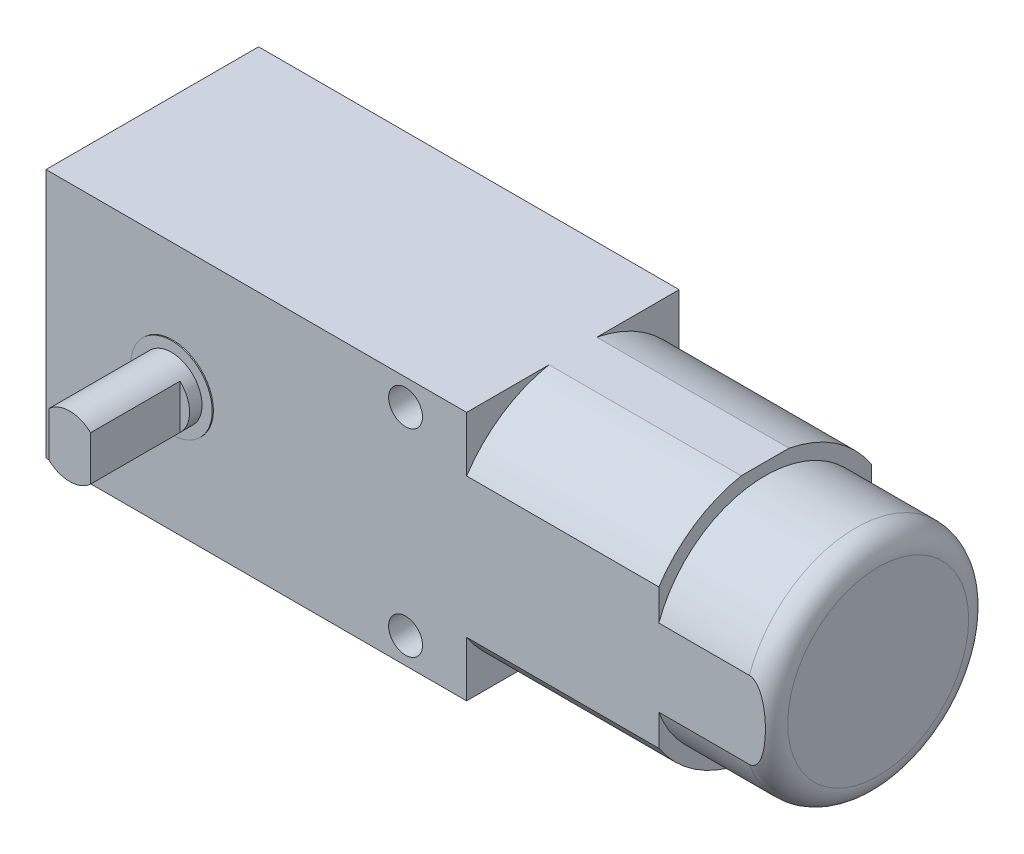
ISO-10303-21;
HEADER;
FILE_DESCRIPTION(('STEP AP214'),'2;1');
FILE_NAME('part.step','',(''),(''),'','','');
FILE_SCHEMA(('AUTOMOTIVE_DESIGN { 1 0 10303 214 1 1 1 1 }'));
ENDSEC;
DATA;
#1=APPLICATION_CONTEXT('core data for automotive mechanical design processes');
#2=APPLICATION_PROTOCOL_DEFINITION('international standard','automotive_design',2000,#1);
#3=PRODUCT_CONTEXT('',#1,'mechanical');
#4=PRODUCT('Part','Part','',(#3));
#5=PRODUCT_RELATED_PRODUCT_CATEGORY('part','',(#4));
#6=PRODUCT_DEFINITION_FORMATION('','',#4);
#7=PRODUCT_DEFINITION_CONTEXT('part definition',#1,'design');
#8=PRODUCT_DEFINITION('design','',#6,#7);
#9=PRODUCT_DEFINITION_SHAPE('','',#8);
#10=(LENGTH_UNIT() NAMED_UNIT(*) SI_UNIT(.MILLI.,.METRE.));
#11=(NAMED_UNIT(*) PLANE_ANGLE_UNIT() SI_UNIT($,.RADIAN.));
#12=(NAMED_UNIT(*) SI_UNIT($,.STERADIAN.) SOLID_ANGLE_UNIT());
#13=UNCERTAINTY_MEASURE_WITH_UNIT(LENGTH_MEASURE(1.E-05),#10,'distance_accuracy_value','');
#14=(GEOMETRIC_REPRESENTATION_CONTEXT(3) GLOBAL_UNCERTAINTY_ASSIGNED_CONTEXT((#13)) GLOBAL_UNIT_ASSIGNED_CONTEXT((#10,
#11,#12)) REPRESENTATION_CONTEXT('',''));
#15=CARTESIAN_POINT('',(0.,0.,0.));
#16=DIRECTION('',(0.,0.,1.));
#17=DIRECTION('',(1.,0.,0.));
#18=AXIS2_PLACEMENT_3D('',#15,#16,#17);
#19=CARTESIAN_POINT('',(64.2,-11.05,-9.4));
#20=DIRECTION('',(0.,0.,1.));
#21=DIRECTION('',(1.,0.,0.));
#22=AXIS2_PLACEMENT_3D('',#19,#20,#21);
#23=PLANE('',#22);
#24=DIRECTION('',(1.,0.,0.));
#25=VECTOR('',#24,1.);
#26=CARTESIAN_POINT('',(54.2,3.4117444218464,-9.4));
#27=LINE('',#26,#25);
#28=CARTESIAN_POINT('',(54.2,3.4117444218464,-9.4));
#29=VERTEX_POINT('',#28);
#30=CARTESIAN_POINT('',(62.2,3.4117444218464,-9.4));
#31=VERTEX_POINT('',#30);
#32=EDGE_CURVE('E186',#29,#31,#27,.T.);
#33=ORIENTED_EDGE('',*,*,#32,.T.);
#34=CARTESIAN_POINT('',(62.2,3.4117444218464,-9.4));
#35=CARTESIAN_POINT('',(62.2424452355427,3.41185713335466,-9.4));
#36=CARTESIAN_POINT('',(62.2847600139285,3.40779082611758,-9.4));
#37=CARTESIAN_POINT('',(62.3676110899501,3.39230440400399,-9.4));
#38=CARTESIAN_POINT('',(62.4081608010595,3.38095712592433,-9.4));
#39=CARTESIAN_POINT('',(62.486705809901,3.35192913929737,-9.4));
#40=CARTESIAN_POINT('',(62.5247095576766,3.33427075464174,-9.4));
#41=CARTESIAN_POINT('',(62.5979473580936,3.2938138454747,-9.4));
#42=CARTESIAN_POINT('',(62.6331739101488,3.27100200372673,-9.4));
#43=CARTESIAN_POINT('',(62.7246162755101,3.20375229428579,-9.4));
#44=CARTESIAN_POINT('',(62.7779854862007,3.15545616211682,-9.4));
#45=CARTESIAN_POINT('',(62.8767960771071,3.0513589229284,-9.4));
#46=CARTESIAN_POINT('',(62.922213907333,2.99553636079868,-9.4));
#47=CARTESIAN_POINT('',(63.0025246853867,2.88418725861646,-9.4));
#48=CARTESIAN_POINT('',(63.0379924003202,2.82906806503439,-9.4));
#49=CARTESIAN_POINT('',(63.1041098382995,2.7159886926686,-9.4));
#50=CARTESIAN_POINT('',(63.1347553193062,2.65802607070646,-9.4));
#51=CARTESIAN_POINT('',(63.2206021902713,2.48102229976637,-9.4));
#52=CARTESIAN_POINT('',(63.2696272007864,2.35899492009959,-9.4));
#53=CARTESIAN_POINT('',(63.3601695871253,2.09694248841986,-9.4));
#54=CARTESIAN_POINT('',(63.40022380031,1.9564361292036,-9.4));
#55=CARTESIAN_POINT('',(63.4688037246126,1.67253040278015,-9.4));
#56=CARTESIAN_POINT('',(63.4973152765614,1.52912770760538,-9.4));
#57=CARTESIAN_POINT('',(63.5451252943434,1.24049999059707,-9.4));
#58=CARTESIAN_POINT('',(63.5644024374481,1.09527153827709,-9.4));
#59=CARTESIAN_POINT('',(63.5951213555044,0.803978799831361,-9.4));
#60=CARTESIAN_POINT('',(63.6065612994958,0.657914326422289,-9.4));
#61=CARTESIAN_POINT('',(63.6252183787894,0.314716466271715,-9.4));
#62=CARTESIAN_POINT('',(63.6295984097009,0.117426164064127,-9.4));
#63=CARTESIAN_POINT('',(63.6263073701391,-0.277195389387359,-9.4));
#64=CARTESIAN_POINT('',(63.6186266212757,-0.47452654633237,-9.4));
#65=CARTESIAN_POINT('',(63.5901754943477,-0.868593691638928,-9.4));
#66=CARTESIAN_POINT('',(63.5693874596252,-1.06532851691648,-9.4));
#67=CARTESIAN_POINT('',(63.5262109114439,-1.35854135933809,-9.4));
#68=CARTESIAN_POINT('',(63.5098313613865,-1.45591356036913,-9.4));
#69=CARTESIAN_POINT('',(63.4724598719395,-1.64976017431326,-9.4));
#70=CARTESIAN_POINT('',(63.4514690554157,-1.7462347998394,-9.4));
#71=CARTESIAN_POINT('',(63.4038261208585,-1.93890284494212,-9.4));
#72=CARTESIAN_POINT('',(63.3771151862187,-2.03508191881406,-9.4));
#73=CARTESIAN_POINT('',(63.3170648451381,-2.22531904258544,-9.4));
#74=CARTESIAN_POINT('',(63.2837298949045,-2.31937847133493,-9.4));
#75=CARTESIAN_POINT('',(63.2091828894291,-2.50352227767631,-9.4));
#76=CARTESIAN_POINT('',(63.1680342342199,-2.59363191733345,-9.4));
#77=CARTESIAN_POINT('',(63.0757080053422,-2.7684680745083,-9.4));
#78=CARTESIAN_POINT('',(63.0245571227123,-2.85320814090503,-9.4));
#79=CARTESIAN_POINT('',(62.9268313875892,-2.98941829265076,-9.4));
#80=CARTESIAN_POINT('',(62.8835310129869,-3.04321321283262,-9.4));
#81=CARTESIAN_POINT('',(62.7895967927138,-3.14408393926965,-9.4));
#82=CARTESIAN_POINT('',(62.7389737070666,-3.19116940632747,-9.4));
#83=CARTESIAN_POINT('',(62.6469696184736,-3.26177129146753,-9.4));
#84=CARTESIAN_POINT('',(62.6077142305004,-3.28803618007025,-9.4));
#85=CARTESIAN_POINT('',(62.5255904523115,-3.33411895936149,-9.4));
#86=CARTESIAN_POINT('',(62.4827291753378,-3.35394918468195,-9.4));
#87=CARTESIAN_POINT('',(62.4009412508458,-3.38304682221297,-9.4));
#88=CARTESIAN_POINT('',(62.3624307235373,-3.39347327028085,-9.4));
#89=CARTESIAN_POINT('',(62.2841722377477,-3.40768128751918,-9.4));
#90=CARTESIAN_POINT('',(62.2444244030235,-3.41146351909236,-9.4));
#91=CARTESIAN_POINT('',(62.164908512337,-3.41199341385013,-9.4));
#92=CARTESIAN_POINT('',(62.1251404685909,-3.40874357795475,-9.4));
#93=CARTESIAN_POINT('',(62.04656344732,-3.39561061109433,-9.4));
#94=CARTESIAN_POINT('',(62.0077583618931,-3.38570404620325,-9.4));
#95=CARTESIAN_POINT('',(61.9700782274125,-3.3726809196957,-9.4));
#96=B_SPLINE_CURVE_WITH_KNOTS('',3,(#34,#35,#36,#37,#38,#39,#40,#41,#42,#43,#44,#45,#46,#47,#48,
#49,#50,#51,#52,#53,#54,#55,#56,#57,#58,#59,#60,#61,#62,#63,#64,#65,#66,#67,#68,#69,#70,#71,#72,
#73,#74,#75,#76,#77,#78,#79,#80,#81,#82,#83,#84,#85,#86,#87,#88,#89,#90,#91,#92,#93,#94,#95),
.UNSPECIFIED.,.F.,.F.,(4,2,2,2,2,2,2,2,2,2,2,2,2,2,2,2,2,2,2,2,2,2,2,2,2,2,2,2,2,2,4),(0.,
0.126934226659636,0.252618027080472,0.377861583759415,0.503432566065117,0.718121186972019,
0.933435283171618,1.12977675330723,1.32628998767683,1.71977991849235,2.15749672188272,
2.59574884918631,3.03500810297968,3.47436994343707,4.06598497178498,4.65807499494745,
5.2509643240876,5.54709889499976,5.84316143547251,6.14242843982891,6.44149479426365,
6.73823090594177,7.03418572228694,7.24086037132175,7.44723435985258,7.58847501975822,
7.72944331310984,7.84861821564906,7.96778123623622,8.08690188405017,8.20644408897797),.UNSPECIFIED.);
#97=CARTESIAN_POINT('',(62.2,-3.4117444218464,-9.4));
#98=VERTEX_POINT('',#97);
#99=EDGE_CURVE('E348',#31,#98,#96,.T.);
#100=ORIENTED_EDGE('',*,*,#99,.T.);
#101=DIRECTION('',(1.,0.,0.));
#102=VECTOR('',#101,1.);
#103=CARTESIAN_POINT('',(54.2,-3.4117444218464,-9.4));
#104=LINE('',#103,#102);
#105=CARTESIAN_POINT('',(54.2,-3.4117444218464,-9.4));
#106=VERTEX_POINT('',#105);
#107=EDGE_CURVE('E205',#106,#98,#104,.T.);
#108=ORIENTED_EDGE('',*,*,#107,.F.);
#109=DIRECTION('',(0.,1.,0.));
#110=VECTOR('',#109,1.);
#111=CARTESIAN_POINT('',(54.2,0.,-9.4));
#112=LINE('',#111,#110);
#113=CARTESIAN_POINT('',(54.2,-6.18081709808663,-9.4));
#114=VERTEX_POINT('',#113);
#115=EDGE_CURVE('E233',#114,#106,#112,.T.);
#116=ORIENTED_EDGE('',*,*,#115,.F.);
#117=DIRECTION('',(1.,0.,0.));
#118=VECTOR('',#117,1.);
#119=CARTESIAN_POINT('',(37.2,-6.18081709808663,-9.4));
#120=LINE('',#119,#118);
#121=CARTESIAN_POINT('',(37.2,-6.18081709808663,-9.4));
#122=VERTEX_POINT('',#121);
#123=EDGE_CURVE('E242',#122,#114,#120,.T.);
#124=ORIENTED_EDGE('',*,*,#123,.F.);
#125=DIRECTION('',(0.,1.,0.));
#126=VECTOR('',#125,1.);
#127=CARTESIAN_POINT('',(37.2,0.,-9.4));
#128=LINE('',#127,#126);
#129=CARTESIAN_POINT('',(37.2,-11.05,-9.4));
#130=VERTEX_POINT('',#129);
#131=EDGE_CURVE('E257',#130,#122,#128,.T.);
#132=ORIENTED_EDGE('',*,*,#131,.F.);
#133=DIRECTION('',(-1.,0.,0.));
#134=VECTOR('',#133,1.);
#135=CARTESIAN_POINT('',(64.2,-11.05,-9.4));
#136=LINE('',#135,#134);
#137=CARTESIAN_POINT('',(0.,-11.05,-9.4));
#138=VERTEX_POINT('',#137);
#139=EDGE_CURVE('E333',#130,#138,#136,.T.);
#140=ORIENTED_EDGE('',*,*,#139,.T.);
#141=DIRECTION('',(0.,1.,0.));
#142=VECTOR('',#141,1.);
#143=CARTESIAN_POINT('',(0.,-11.05,-9.4));
#144=LINE('',#143,#142);
#145=CARTESIAN_POINT('',(0.,11.05,-9.4));
#146=VERTEX_POINT('',#145);
#147=EDGE_CURVE('E321',#138,#146,#144,.T.);
#148=ORIENTED_EDGE('',*,*,#147,.T.);
#149=DIRECTION('',(-1.,0.,0.));
#150=VECTOR('',#149,1.);
#151=CARTESIAN_POINT('',(64.2,11.05,-9.4));
#152=LINE('',#151,#150);
#153=CARTESIAN_POINT('',(37.2,11.05,-9.4));
#154=VERTEX_POINT('',#153);
#155=EDGE_CURVE('E339',#154,#146,#152,.T.);
#156=ORIENTED_EDGE('',*,*,#155,.F.);
#157=DIRECTION('',(0.,1.,0.));
#158=VECTOR('',#157,1.);
#159=CARTESIAN_POINT('',(37.2,0.,-9.4));
#160=LINE('',#159,#158);
#161=CARTESIAN_POINT('',(37.2,6.18081709808663,-9.4));
#162=VERTEX_POINT('',#161);
#163=EDGE_CURVE('E241',#162,#154,#160,.T.);
#164=ORIENTED_EDGE('',*,*,#163,.F.);
#165=DIRECTION('',(1.,0.,0.));
#166=VECTOR('',#165,1.);
#167=CARTESIAN_POINT('',(37.2,6.18081709808663,-9.4));
#168=LINE('',#167,#166);
#169=CARTESIAN_POINT('',(54.2,6.18081709808663,-9.4));
#170=VERTEX_POINT('',#169);
#171=EDGE_CURVE('E209',#162,#170,#168,.T.);
#172=ORIENTED_EDGE('',*,*,#171,.T.);
#173=DIRECTION('',(0.,1.,0.));
#174=VECTOR('',#173,1.);
#175=CARTESIAN_POINT('',(54.2,0.,-9.4));
#176=LINE('',#175,#174);
#177=EDGE_CURVE('E201',#29,#170,#176,.T.);
#178=ORIENTED_EDGE('',*,*,#177,.F.);
#179=EDGE_LOOP('',(#33,#100,#108,#116,#124,#132,#140,#148,#156,#164,#172,#178));
#180=FACE_BOUND('',#179,.T.);
#181=ADVANCED_FACE('F42',(#180),#23,.F.);
#182=CARTESIAN_POINT('',(64.2,11.05,9.4));
#183=DIRECTION('',(0.,-1.,0.));
#184=DIRECTION('',(0.,0.,-1.));
#185=AXIS2_PLACEMENT_3D('',#182,#183,#184);
#186=PLANE('',#185);
#187=DIRECTION('',(0.,0.,1.));
#188=VECTOR('',#187,1.);
#189=CARTESIAN_POINT('',(54.2,11.05,0.));
#190=LINE('',#189,#188);
#191=CARTESIAN_POINT('',(54.2,11.05,-2.1118712081943));
#192=VERTEX_POINT('',#191);
#193=CARTESIAN_POINT('',(54.2,11.05,2.1118712081943));
#194=VERTEX_POINT('',#193);
#195=EDGE_CURVE('E212',#192,#194,#190,.T.);
#196=ORIENTED_EDGE('',*,*,#195,.F.);
#197=DIRECTION('',(1.,0.,0.));
#198=VECTOR('',#197,1.);
#199=CARTESIAN_POINT('',(37.2,11.05,-2.1118712081943));
#200=LINE('',#199,#198);
#201=CARTESIAN_POINT('',(37.2,11.05,-2.1118712081943));
#202=VERTEX_POINT('',#201);
#203=EDGE_CURVE('E247',#202,#192,#200,.T.);
#204=ORIENTED_EDGE('',*,*,#203,.F.);
#205=DIRECTION('',(0.,0.,1.));
#206=VECTOR('',#205,1.);
#207=CARTESIAN_POINT('',(37.2,11.05,0.));
#208=LINE('',#207,#206);
#209=EDGE_CURVE('E244',#154,#202,#208,.T.);
#210=ORIENTED_EDGE('',*,*,#209,.F.);
#211=ORIENTED_EDGE('',*,*,#155,.T.);
#212=DIRECTION('',(0.,0.,1.));
#213=VECTOR('',#212,1.);
#214=CARTESIAN_POINT('',(0.,11.05,9.4));
#215=LINE('',#214,#213);
#216=CARTESIAN_POINT('',(0.,11.05,9.4));
#217=VERTEX_POINT('',#216);
#218=EDGE_CURVE('E324',#146,#217,#215,.T.);
#219=ORIENTED_EDGE('',*,*,#218,.T.);
#220=DIRECTION('',(-1.,0.,0.));
#221=VECTOR('',#220,1.);
#222=CARTESIAN_POINT('',(64.2,11.05,9.4));
#223=LINE('',#222,#221);
#224=CARTESIAN_POINT('',(37.2,11.05,9.4));
#225=VERTEX_POINT('',#224);
#226=EDGE_CURVE('E337',#225,#217,#223,.T.);
#227=ORIENTED_EDGE('',*,*,#226,.F.);
#228=DIRECTION('',(0.,0.,1.));
#229=VECTOR('',#228,1.);
#230=CARTESIAN_POINT('',(37.2,11.05,0.));
#231=LINE('',#230,#229);
#232=CARTESIAN_POINT('',(37.2,11.05,2.1118712081943));
#233=VERTEX_POINT('',#232);
#234=EDGE_CURVE('E277',#233,#225,#231,.T.);
#235=ORIENTED_EDGE('',*,*,#234,.F.);
#236=DIRECTION('',(1.,0.,0.));
#237=VECTOR('',#236,1.);
#238=CARTESIAN_POINT('',(37.2,11.05,2.1118712081943));
#239=LINE('',#238,#237);
#240=EDGE_CURVE('E282',#233,#194,#239,.T.);
#241=ORIENTED_EDGE('',*,*,#240,.T.);
#242=EDGE_LOOP('',(#196,#204,#210,#211,#219,#227,#235,#241));
#243=FACE_BOUND('',#242,.T.);
#244=ADVANCED_FACE('F356',(#243),#186,.F.);
#245=CARTESIAN_POINT('',(64.2,-11.05,9.4));
#246=DIRECTION('',(0.,0.,-1.));
#247=DIRECTION('',(-1.,0.,0.));
#248=AXIS2_PLACEMENT_3D('',#245,#246,#247);
#249=PLANE('',#248);
#250=CARTESIAN_POINT('',(31.7999999999999,8.75,9.4));
#251=DIRECTION('',(0.,0.,1.));
#252=DIRECTION('',(1.,0.,0.));
#253=AXIS2_PLACEMENT_3D('',#250,#251,#252);
#254=CIRCLE('',#253,1.5);
#255=CARTESIAN_POINT('',(33.2999999999999,8.75,9.4));
#256=VERTEX_POINT('',#255);
#257=EDGE_CURVE('E470',#256,#256,#254,.T.);
#258=ORIENTED_EDGE('',*,*,#257,.F.);
#259=EDGE_LOOP('',(#258));
#260=FACE_BOUND('',#259,.T.);
#261=CARTESIAN_POINT('',(31.7999999999999,-8.75,9.4));
#262=DIRECTION('',(0.,0.,1.));
#263=DIRECTION('',(-1.,0.,0.));
#264=AXIS2_PLACEMENT_3D('',#261,#262,#263);
#265=CIRCLE('',#264,1.5);
#266=CARTESIAN_POINT('',(30.2999999999999,-8.75,9.4));
#267=VERTEX_POINT('',#266);
#268=EDGE_CURVE('E477',#267,#267,#265,.T.);
#269=ORIENTED_EDGE('',*,*,#268,.F.);
#270=EDGE_LOOP('',(#269));
#271=FACE_BOUND('',#270,.T.);
#272=CARTESIAN_POINT('',(11.2,0.,9.4));
#273=DIRECTION('',(0.,0.,-1.));
#274=DIRECTION('',(-1.,0.,0.));
#275=AXIS2_PLACEMENT_3D('',#272,#273,#274);
#276=CIRCLE('',#275,3.6);
#277=CARTESIAN_POINT('',(7.6,0.,9.4));
#278=VERTEX_POINT('',#277);
#279=EDGE_CURVE('E341',#278,#278,#276,.F.);
#280=ORIENTED_EDGE('',*,*,#279,.F.);
#281=EDGE_LOOP('',(#280));
#282=FACE_BOUND('',#281,.T.);
#283=DIRECTION('',(1.,0.,0.));
#284=VECTOR('',#283,1.);
#285=CARTESIAN_POINT('',(54.2,-3.41174442184639,9.4));
#286=LINE('',#285,#284);
#287=CARTESIAN_POINT('',(54.2,-3.41174442184639,9.4));
#288=VERTEX_POINT('',#287);
#289=CARTESIAN_POINT('',(62.2,-3.41174442184639,9.4));
#290=VERTEX_POINT('',#289);
#291=EDGE_CURVE('E236',#288,#290,#286,.T.);
#292=ORIENTED_EDGE('',*,*,#291,.T.);
#293=CARTESIAN_POINT('',(62.2,-3.41174442184639,9.4));
#294=CARTESIAN_POINT('',(62.2424452355427,-3.41185713335465,9.4));
#295=CARTESIAN_POINT('',(62.2847600139285,-3.40779082611757,9.4));
#296=CARTESIAN_POINT('',(62.3676110899501,-3.39230440400398,9.4));
#297=CARTESIAN_POINT('',(62.4081608010595,-3.38095712592432,9.4));
#298=CARTESIAN_POINT('',(62.486705809901,-3.35192913929736,9.4));
#299=CARTESIAN_POINT('',(62.5247095576766,-3.33427075464173,9.4));
#300=CARTESIAN_POINT('',(62.5979473580936,-3.29381384547468,9.4));
#301=CARTESIAN_POINT('',(62.6331739101488,-3.27100200372672,9.4));
#302=CARTESIAN_POINT('',(62.7246162755101,-3.20375229428578,9.4));
#303=CARTESIAN_POINT('',(62.7779854862007,-3.1554561621168,9.4));
#304=CARTESIAN_POINT('',(62.8767960771071,-3.05135892292839,9.4));
#305=CARTESIAN_POINT('',(62.922213907333,-2.99553636079866,9.4));
#306=CARTESIAN_POINT('',(63.0025246853867,-2.88418725861645,9.4));
#307=CARTESIAN_POINT('',(63.0379924003203,-2.82906806503438,9.4));
#308=CARTESIAN_POINT('',(63.1041098382995,-2.71598869266859,9.4));
#309=CARTESIAN_POINT('',(63.1347553193062,-2.65802607070644,9.4));
#310=CARTESIAN_POINT('',(63.2206021902713,-2.48102229976635,9.4));
#311=CARTESIAN_POINT('',(63.2696272007864,-2.35899492009958,9.4));
#312=CARTESIAN_POINT('',(63.3601695871253,-2.09694248841984,9.4));
#313=CARTESIAN_POINT('',(63.40022380031,-1.95643612920359,9.4));
#314=CARTESIAN_POINT('',(63.4688037246126,-1.67253040278013,9.4));
#315=CARTESIAN_POINT('',(63.4973152765614,-1.52912770760535,9.4));
#316=CARTESIAN_POINT('',(63.5451252943434,-1.24049999059705,9.4));
#317=CARTESIAN_POINT('',(63.5644024374481,-1.09527153827706,9.4));
#318=CARTESIAN_POINT('',(63.5951213555044,-0.803978799831333,9.4));
#319=CARTESIAN_POINT('',(63.6065612994958,-0.65791432642226,9.4));
#320=CARTESIAN_POINT('',(63.6252183787894,-0.314716466271684,9.4));
#321=CARTESIAN_POINT('',(63.6295984097009,-0.117426164064095,9.4));
#322=CARTESIAN_POINT('',(63.6263073701391,0.277195389387395,9.4));
#323=CARTESIAN_POINT('',(63.6186266212757,0.474526546332407,9.4));
#324=CARTESIAN_POINT('',(63.5901754943477,0.868593691638967,9.4));
#325=CARTESIAN_POINT('',(63.5693874596251,1.06532851691652,9.4));
#326=CARTESIAN_POINT('',(63.5262109114439,1.35854135933814,9.4));
#327=CARTESIAN_POINT('',(63.5098313613865,1.45591356036918,9.4));
#328=CARTESIAN_POINT('',(63.4724598719395,1.64976017431331,9.4));
#329=CARTESIAN_POINT('',(63.4514690554157,1.74623479983944,9.4));
#330=CARTESIAN_POINT('',(63.4038261208585,1.93890284494217,9.4));
#331=CARTESIAN_POINT('',(63.3771151862187,2.0350819188141,9.4));
#332=CARTESIAN_POINT('',(63.3170648451381,2.22531904258548,9.4));
#333=CARTESIAN_POINT('',(63.2837298949044,2.31937847133497,9.4));
#334=CARTESIAN_POINT('',(63.2091828894291,2.50352227767636,9.4));
#335=CARTESIAN_POINT('',(63.1680342342199,2.5936319173335,9.4));
#336=CARTESIAN_POINT('',(63.0757080053422,2.76846807450835,9.4));
#337=CARTESIAN_POINT('',(63.0245571227123,2.85320814090508,9.4));
#338=CARTESIAN_POINT('',(62.9268313875892,2.9894182926508,9.4));
#339=CARTESIAN_POINT('',(62.8835310129868,3.04321321283265,9.4));
#340=CARTESIAN_POINT('',(62.7895967927137,3.14408393926967,9.4));
#341=CARTESIAN_POINT('',(62.7389737070666,3.19116940632748,9.4));
#342=CARTESIAN_POINT('',(62.6469696184736,3.26177129146754,9.4));
#343=CARTESIAN_POINT('',(62.6077142305004,3.28803618007025,9.4));
#344=CARTESIAN_POINT('',(62.5255904523115,3.33411895936149,9.4));
#345=CARTESIAN_POINT('',(62.4827291753378,3.35394918468194,9.4));
#346=CARTESIAN_POINT('',(62.4009412508457,3.38304682221296,9.4));
#347=CARTESIAN_POINT('',(62.3624307235372,3.39347327028085,9.4));
#348=CARTESIAN_POINT('',(62.2841722377476,3.40768128751917,9.4));
#349=CARTESIAN_POINT('',(62.2444244030235,3.41146351909234,9.4));
#350=CARTESIAN_POINT('',(62.164908512337,3.41199341385012,9.4));
#351=CARTESIAN_POINT('',(62.1251404685909,3.40874357795474,9.4));
#352=CARTESIAN_POINT('',(62.04656344732,3.39561061109431,9.4));
#353=CARTESIAN_POINT('',(62.0077583618931,3.38570404620324,9.4));
#354=CARTESIAN_POINT('',(61.9700782274125,3.37268091969568,9.4));
#355=B_SPLINE_CURVE_WITH_KNOTS('',3,(#293,#294,#295,#296,#297,#298,#299,#300,#301,#302,#303,
#304,#305,#306,#307,#308,#309,#310,#311,#312,#313,#314,#315,#316,#317,#318,#319,#320,#321,#322,
#323,#324,#325,#326,#327,#328,#329,#330,#331,#332,#333,#334,#335,#336,#337,#338,#339,#340,#341,
#342,#343,#344,#345,#346,#347,#348,#349,#350,#351,#352,#353,#354),.UNSPECIFIED.,.F.,.F.,(4,2,2,
2,2,2,2,2,2,2,2,2,2,2,2,2,2,2,2,2,2,2,2,2,2,2,2,2,2,2,4),(0.,0.126934226659636,
0.252618027080472,0.377861583759415,0.503432566065118,0.718121186972021,0.93343528317162,
1.12977675330724,1.32628998767683,1.71977991849236,2.15749672188273,2.59574884918632,
3.0350081029797,3.47436994343709,4.06598497178501,4.65807499494748,5.25096432408763,
5.54709889499979,5.84316143547254,6.14242843982895,6.44149479426368,6.7382309059418,
7.03418572228699,7.24086037132177,7.44723435985259,7.58847501975823,7.72944331310984,
7.84861821564906,7.96778123623621,8.08690188405016,8.20644408897796),.UNSPECIFIED.);
#356=CARTESIAN_POINT('',(62.2,3.41174442184639,9.4));
#357=VERTEX_POINT('',#356);
#358=EDGE_CURVE('E12',#290,#357,#355,.T.);
#359=ORIENTED_EDGE('',*,*,#358,.T.);
#360=DIRECTION('',(1.,0.,0.));
#361=VECTOR('',#360,1.);
#362=CARTESIAN_POINT('',(54.2,3.41174442184639,9.4));
#363=LINE('',#362,#361);
#364=CARTESIAN_POINT('',(54.2,3.41174442184639,9.4));
#365=VERTEX_POINT('',#364);
#366=EDGE_CURVE('E196',#365,#357,#363,.T.);
#367=ORIENTED_EDGE('',*,*,#366,.F.);
#368=DIRECTION('',(0.,-1.,0.));
#369=VECTOR('',#368,1.);
#370=CARTESIAN_POINT('',(54.2,0.,9.4));
#371=LINE('',#370,#369);
#372=CARTESIAN_POINT('',(54.2,6.18081709808663,9.4));
#373=VERTEX_POINT('',#372);
#374=EDGE_CURVE('E197',#373,#365,#371,.T.);
#375=ORIENTED_EDGE('',*,*,#374,.F.);
#376=DIRECTION('',(1.,0.,0.));
#377=VECTOR('',#376,1.);
#378=CARTESIAN_POINT('',(37.2,6.18081709808663,9.4));
#379=LINE('',#378,#377);
#380=CARTESIAN_POINT('',(37.2,6.18081709808663,9.4));
#381=VERTEX_POINT('',#380);
#382=EDGE_CURVE('E283',#381,#373,#379,.T.);
#383=ORIENTED_EDGE('',*,*,#382,.F.);
#384=DIRECTION('',(0.,-1.,0.));
#385=VECTOR('',#384,1.);
#386=CARTESIAN_POINT('',(37.2,0.,9.4));
#387=LINE('',#386,#385);
#388=EDGE_CURVE('E279',#225,#381,#387,.T.);
#389=ORIENTED_EDGE('',*,*,#388,.F.);
#390=ORIENTED_EDGE('',*,*,#226,.T.);
#391=DIRECTION('',(0.,-1.,0.));
#392=VECTOR('',#391,1.);
#393=CARTESIAN_POINT('',(0.,-11.05,9.4));
#394=LINE('',#393,#392);
#395=CARTESIAN_POINT('',(0.,-11.05,9.4));
#396=VERTEX_POINT('',#395);
#397=EDGE_CURVE('E327',#217,#396,#394,.T.);
#398=ORIENTED_EDGE('',*,*,#397,.T.);
#399=DIRECTION('',(-1.,0.,0.));
#400=VECTOR('',#399,1.);
#401=CARTESIAN_POINT('',(64.2,-11.05,9.4));
#402=LINE('',#401,#400);
#403=CARTESIAN_POINT('',(37.2,-11.05,9.4));
#404=VERTEX_POINT('',#403);
#405=EDGE_CURVE('E335',#404,#396,#402,.T.);
#406=ORIENTED_EDGE('',*,*,#405,.F.);
#407=DIRECTION('',(0.,-1.,0.));
#408=VECTOR('',#407,1.);
#409=CARTESIAN_POINT('',(37.2,0.,9.4));
#410=LINE('',#409,#408);
#411=CARTESIAN_POINT('',(37.2,-6.18081709808663,9.4));
#412=VERTEX_POINT('',#411);
#413=EDGE_CURVE('E266',#412,#404,#410,.T.);
#414=ORIENTED_EDGE('',*,*,#413,.F.);
#415=DIRECTION('',(1.,0.,0.));
#416=VECTOR('',#415,1.);
#417=CARTESIAN_POINT('',(37.2,-6.18081709808663,9.4));
#418=LINE('',#417,#416);
#419=CARTESIAN_POINT('',(54.2,-6.18081709808663,9.4));
#420=VERTEX_POINT('',#419);
#421=EDGE_CURVE('E271',#412,#420,#418,.T.);
#422=ORIENTED_EDGE('',*,*,#421,.T.);
#423=DIRECTION('',(0.,-1.,0.));
#424=VECTOR('',#423,1.);
#425=CARTESIAN_POINT('',(54.2,0.,9.4));
#426=LINE('',#425,#424);
#427=EDGE_CURVE('E224',#288,#420,#426,.T.);
#428=ORIENTED_EDGE('',*,*,#427,.F.);
#429=EDGE_LOOP('',(#292,#359,#367,#375,#383,#389,#390,#398,#406,#414,#422,#428));
#430=FACE_BOUND('',#429,.T.);
#431=ADVANCED_FACE('F358',(#260,#271,#282,#430),#249,.F.);
#432=CARTESIAN_POINT('',(64.2,-11.05,9.4));
#433=DIRECTION('',(0.,1.,0.));
#434=DIRECTION('',(0.,0.,1.));
#435=AXIS2_PLACEMENT_3D('',#432,#433,#434);
#436=PLANE('',#435);
#437=DIRECTION('',(0.,0.,-1.));
#438=VECTOR('',#437,1.);
#439=CARTESIAN_POINT('',(54.2,-11.05,0.));
#440=LINE('',#439,#438);
#441=CARTESIAN_POINT('',(54.2,-11.05,2.11187120819428));
#442=VERTEX_POINT('',#441);
#443=CARTESIAN_POINT('',(54.2,-11.05,-2.11187120819428));
#444=VERTEX_POINT('',#443);
#445=EDGE_CURVE('E229',#442,#444,#440,.T.);
#446=ORIENTED_EDGE('',*,*,#445,.F.);
#447=DIRECTION('',(1.,0.,0.));
#448=VECTOR('',#447,1.);
#449=CARTESIAN_POINT('',(37.2,-11.05,2.11187120819428));
#450=LINE('',#449,#448);
#451=CARTESIAN_POINT('',(37.2,-11.05,2.11187120819428));
#452=VERTEX_POINT('',#451);
#453=EDGE_CURVE('E255',#452,#442,#450,.T.);
#454=ORIENTED_EDGE('',*,*,#453,.F.);
#455=DIRECTION('',(0.,0.,-1.));
#456=VECTOR('',#455,1.);
#457=CARTESIAN_POINT('',(37.2,-11.05,0.));
#458=LINE('',#457,#456);
#459=EDGE_CURVE('E268',#404,#452,#458,.T.);
#460=ORIENTED_EDGE('',*,*,#459,.F.);
#461=ORIENTED_EDGE('',*,*,#405,.T.);
#462=DIRECTION('',(0.,0.,-1.));
#463=VECTOR('',#462,1.);
#464=CARTESIAN_POINT('',(0.,-11.05,9.4));
#465=LINE('',#464,#463);
#466=EDGE_CURVE('E330',#396,#138,#465,.T.);
#467=ORIENTED_EDGE('',*,*,#466,.T.);
#468=ORIENTED_EDGE('',*,*,#139,.F.);
#469=DIRECTION('',(0.,0.,-1.));
#470=VECTOR('',#469,1.);
#471=CARTESIAN_POINT('',(37.2,-11.05,0.));
#472=LINE('',#471,#470);
#473=CARTESIAN_POINT('',(37.2,-11.05,-2.11187120819428));
#474=VERTEX_POINT('',#473);
#475=EDGE_CURVE('E254',#474,#130,#472,.T.);
#476=ORIENTED_EDGE('',*,*,#475,.F.);
#477=DIRECTION('',(1.,0.,0.));
#478=VECTOR('',#477,1.);
#479=CARTESIAN_POINT('',(37.2,-11.05,-2.11187120819428));
#480=LINE('',#479,#478);
#481=EDGE_CURVE('E260',#474,#444,#480,.T.);
#482=ORIENTED_EDGE('',*,*,#481,.T.);
#483=EDGE_LOOP('',(#446,#454,#460,#461,#467,#468,#476,#482));
#484=FACE_BOUND('',#483,.T.);
#485=ADVANCED_FACE('F363',(#484),#436,.F.);
#486=CARTESIAN_POINT('',(64.2,0.,0.));
#487=DIRECTION('',(-1.,0.,0.));
#488=DIRECTION('',(0.,0.,1.));
#489=AXIS2_PLACEMENT_3D('',#486,#487,#488);
#490=PLANE('',#489);
#491=CARTESIAN_POINT('',(64.2,0.,0.));
#492=DIRECTION('',(-1.,0.,0.));
#493=DIRECTION('',(0.,0.,1.));
#494=AXIS2_PLACEMENT_3D('',#491,#492,#493);
#495=CIRCLE('',#494,8.);
#496=CARTESIAN_POINT('',(64.2,2.72939553747712,-7.52));
#497=VERTEX_POINT('',#496);
#498=EDGE_CURVE('E61',#497,#497,#495,.F.);
#499=ORIENTED_EDGE('',*,*,#498,.T.);
#500=EDGE_LOOP('',(#499));
#501=FACE_BOUND('',#500,.T.);
#502=ADVANCED_FACE('F367',(#501),#490,.F.);
#503=CARTESIAN_POINT('',(37.2,0.,0.));
#504=DIRECTION('',(1.,0.,0.));
#505=DIRECTION('',(0.,0.,-1.));
#506=AXIS2_PLACEMENT_3D('',#503,#504,#505);
#507=CYLINDRICAL_SURFACE('',#506,11.25);
#508=ORIENTED_EDGE('',*,*,#382,.T.);
#509=CARTESIAN_POINT('',(54.2,0.,0.));
#510=DIRECTION('',(1.,0.,0.));
#511=DIRECTION('',(0.,0.,-1.));
#512=AXIS2_PLACEMENT_3D('',#509,#510,#511);
#513=CIRCLE('',#512,11.25);
#514=EDGE_CURVE('E217',#194,#373,#513,.T.);
#515=ORIENTED_EDGE('',*,*,#514,.F.);
#516=ORIENTED_EDGE('',*,*,#240,.F.);
#517=CARTESIAN_POINT('',(37.2,0.,0.));
#518=DIRECTION('',(1.,0.,0.));
#519=DIRECTION('',(0.,0.,-1.));
#520=AXIS2_PLACEMENT_3D('',#517,#518,#519);
#521=CIRCLE('',#520,11.25);
#522=EDGE_CURVE('E250',#233,#381,#521,.T.);
#523=ORIENTED_EDGE('',*,*,#522,.T.);
#524=EDGE_LOOP('',(#508,#515,#516,#523));
#525=FACE_BOUND('',#524,.T.);
#526=ADVANCED_FACE('F377',(#525),#507,.T.);
#527=CARTESIAN_POINT('',(37.2,0.,0.));
#528=DIRECTION('',(1.,0.,0.));
#529=DIRECTION('',(0.,0.,-1.));
#530=AXIS2_PLACEMENT_3D('',#527,#528,#529);
#531=CYLINDRICAL_SURFACE('',#530,11.25);
#532=ORIENTED_EDGE('',*,*,#203,.T.);
#533=CARTESIAN_POINT('',(54.2,0.,0.));
#534=DIRECTION('',(1.,0.,0.));
#535=DIRECTION('',(0.,0.,-1.));
#536=AXIS2_PLACEMENT_3D('',#533,#534,#535);
#537=CIRCLE('',#536,11.25);
#538=EDGE_CURVE('E210',#170,#192,#537,.T.);
#539=ORIENTED_EDGE('',*,*,#538,.F.);
#540=ORIENTED_EDGE('',*,*,#171,.F.);
#541=CARTESIAN_POINT('',(37.2,0.,0.));
#542=DIRECTION('',(1.,0.,0.));
#543=DIRECTION('',(0.,0.,-1.));
#544=AXIS2_PLACEMENT_3D('',#541,#542,#543);
#545=CIRCLE('',#544,11.25);
#546=EDGE_CURVE('E239',#162,#202,#545,.T.);
#547=ORIENTED_EDGE('',*,*,#546,.T.);
#548=EDGE_LOOP('',(#532,#539,#540,#547));
#549=FACE_BOUND('',#548,.T.);
#550=ADVANCED_FACE('F413',(#549),#531,.T.);
#551=CARTESIAN_POINT('',(37.2,0.,0.));
#552=DIRECTION('',(1.,0.,0.));
#553=DIRECTION('',(0.,0.,-1.));
#554=AXIS2_PLACEMENT_3D('',#551,#552,#553);
#555=CYLINDRICAL_SURFACE('',#554,11.25);
#556=ORIENTED_EDGE('',*,*,#123,.T.);
#557=CARTESIAN_POINT('',(54.2,0.,0.));
#558=DIRECTION('',(1.,0.,0.));
#559=DIRECTION('',(0.,0.,-1.));
#560=AXIS2_PLACEMENT_3D('',#557,#558,#559);
#561=CIRCLE('',#560,11.25);
#562=EDGE_CURVE('E231',#444,#114,#561,.T.);
#563=ORIENTED_EDGE('',*,*,#562,.F.);
#564=ORIENTED_EDGE('',*,*,#481,.F.);
#565=CARTESIAN_POINT('',(37.2,0.,0.));
#566=DIRECTION('',(1.,0.,0.));
#567=DIRECTION('',(0.,0.,-1.));
#568=AXIS2_PLACEMENT_3D('',#565,#566,#567);
#569=CIRCLE('',#568,11.25);
#570=EDGE_CURVE('E252',#474,#122,#569,.T.);
#571=ORIENTED_EDGE('',*,*,#570,.T.);
#572=EDGE_LOOP('',(#556,#563,#564,#571));
#573=FACE_BOUND('',#572,.T.);
#574=ADVANCED_FACE('F421',(#573),#555,.T.);
#575=CARTESIAN_POINT('',(37.2,0.,0.));
#576=DIRECTION('',(1.,0.,0.));
#577=DIRECTION('',(0.,0.,-1.));
#578=AXIS2_PLACEMENT_3D('',#575,#576,#577);
#579=CYLINDRICAL_SURFACE('',#578,11.25);
#580=ORIENTED_EDGE('',*,*,#453,.T.);
#581=CARTESIAN_POINT('',(54.2,0.,0.));
#582=DIRECTION('',(1.,0.,0.));
#583=DIRECTION('',(0.,0.,-1.));
#584=AXIS2_PLACEMENT_3D('',#581,#582,#583);
#585=CIRCLE('',#584,11.25);
#586=EDGE_CURVE('E227',#420,#442,#585,.T.);
#587=ORIENTED_EDGE('',*,*,#586,.F.);
#588=ORIENTED_EDGE('',*,*,#421,.F.);
#589=CARTESIAN_POINT('',(37.2,0.,0.));
#590=DIRECTION('',(1.,0.,0.));
#591=DIRECTION('',(0.,0.,-1.));
#592=AXIS2_PLACEMENT_3D('',#589,#590,#591);
#593=CIRCLE('',#592,11.25);
#594=EDGE_CURVE('E220',#412,#452,#593,.T.);
#595=ORIENTED_EDGE('',*,*,#594,.T.);
#596=EDGE_LOOP('',(#580,#587,#588,#595));
#597=FACE_BOUND('',#596,.T.);
#598=ADVANCED_FACE('F390',(#597),#579,.T.);
#599=CARTESIAN_POINT('',(11.2,0.,35.2367532368147));
#600=DIRECTION('',(0.,0.,-1.));
#601=DIRECTION('',(-1.,0.,0.));
#602=AXIS2_PLACEMENT_3D('',#599,#600,#601);
#603=CYLINDRICAL_SURFACE('',#602,2.7);
#604=CARTESIAN_POINT('',(11.2,0.,9.5));
#605=DIRECTION('',(0.,0.,1.));
#606=DIRECTION('',(1.,0.,0.));
#607=AXIS2_PLACEMENT_3D('',#604,#605,#606);
#608=CIRCLE('',#607,2.7);
#609=CARTESIAN_POINT('',(13.9,0.,9.5));
#610=VERTEX_POINT('',#609);
#611=EDGE_CURVE('E317',#610,#610,#608,.F.);
#612=ORIENTED_EDGE('',*,*,#611,.F.);
#613=EDGE_LOOP('',(#612));
#614=FACE_BOUND('',#613,.T.);
#615=DIRECTION('',(0.,0.,1.));
#616=VECTOR('',#615,1.);
#617=CARTESIAN_POINT('',(9.35,1.96659604392971,10.6));
#618=LINE('',#617,#616);
#619=CARTESIAN_POINT('',(9.35,1.96659604392971,10.6));
#620=VERTEX_POINT('',#619);
#621=CARTESIAN_POINT('',(9.35,1.96659604392971,18.5));
#622=VERTEX_POINT('',#621);
#623=EDGE_CURVE('E295',#620,#622,#618,.T.);
#624=ORIENTED_EDGE('',*,*,#623,.T.);
#625=CARTESIAN_POINT('',(11.2,0.,18.5));
#626=DIRECTION('',(0.,0.,-1.));
#627=DIRECTION('',(-1.,0.,0.));
#628=AXIS2_PLACEMENT_3D('',#625,#626,#627);
#629=CIRCLE('',#628,2.7);
#630=CARTESIAN_POINT('',(13.05,1.96659604392971,18.5));
#631=VERTEX_POINT('',#630);
#632=EDGE_CURVE('E314',#622,#631,#629,.T.);
#633=ORIENTED_EDGE('',*,*,#632,.T.);
#634=DIRECTION('',(0.,0.,1.));
#635=VECTOR('',#634,1.);
#636=CARTESIAN_POINT('',(13.05,1.96659604392971,10.6));
#637=LINE('',#636,#635);
#638=CARTESIAN_POINT('',(13.05,1.96659604392971,10.6));
#639=VERTEX_POINT('',#638);
#640=EDGE_CURVE('E309',#639,#631,#637,.T.);
#641=ORIENTED_EDGE('',*,*,#640,.F.);
#642=CARTESIAN_POINT('',(11.2,0.,10.6));
#643=DIRECTION('',(0.,0.,1.));
#644=DIRECTION('',(1.,0.,0.));
#645=AXIS2_PLACEMENT_3D('',#642,#643,#644);
#646=CIRCLE('',#645,2.7);
#647=CARTESIAN_POINT('',(13.05,-1.96659604392971,10.6));
#648=VERTEX_POINT('',#647);
#649=EDGE_CURVE('E304',#648,#639,#646,.T.);
#650=ORIENTED_EDGE('',*,*,#649,.F.);
#651=DIRECTION('',(0.,0.,1.));
#652=VECTOR('',#651,1.);
#653=CARTESIAN_POINT('',(13.05,-1.96659604392971,10.6));
#654=LINE('',#653,#652);
#655=CARTESIAN_POINT('',(13.05,-1.96659604392971,18.5));
#656=VERTEX_POINT('',#655);
#657=EDGE_CURVE('E298',#648,#656,#654,.T.);
#658=ORIENTED_EDGE('',*,*,#657,.T.);
#659=CARTESIAN_POINT('',(9.35,-1.96659604392971,18.5));
#660=VERTEX_POINT('',#659);
#661=EDGE_CURVE('E301',#656,#660,#629,.T.);
#662=ORIENTED_EDGE('',*,*,#661,.T.);
#663=DIRECTION('',(0.,0.,1.));
#664=VECTOR('',#663,1.);
#665=CARTESIAN_POINT('',(9.35,-1.96659604392971,10.6));
#666=LINE('',#665,#664);
#667=CARTESIAN_POINT('',(9.35,-1.96659604392971,10.6));
#668=VERTEX_POINT('',#667);
#669=EDGE_CURVE('E299',#668,#660,#666,.T.);
#670=ORIENTED_EDGE('',*,*,#669,.F.);
#671=CARTESIAN_POINT('',(11.2,0.,10.6));
#672=DIRECTION('',(0.,0.,1.));
#673=DIRECTION('',(1.,0.,0.));
#674=AXIS2_PLACEMENT_3D('',#671,#672,#673);
#675=CIRCLE('',#674,2.7);
#676=EDGE_CURVE('E291',#620,#668,#675,.T.);
#677=ORIENTED_EDGE('',*,*,#676,.F.);
#678=EDGE_LOOP('',(#624,#633,#641,#650,#658,#662,#670,#677));
#679=FACE_BOUND('',#678,.T.);
#680=ADVANCED_FACE('F387',(#614,#679),#603,.T.);
#681=CARTESIAN_POINT('',(64.2,-11.05,18.5));
#682=DIRECTION('',(0.,0.,-1.));
#683=DIRECTION('',(-1.,0.,0.));
#684=AXIS2_PLACEMENT_3D('',#681,#682,#683);
#685=PLANE('',#684);
#686=DIRECTION('',(0.,-1.,0.));
#687=VECTOR('',#686,1.);
#688=CARTESIAN_POINT('',(9.35,0.,18.5));
#689=LINE('',#688,#687);
#690=EDGE_CURVE('E292',#622,#660,#689,.T.);
#691=ORIENTED_EDGE('',*,*,#690,.T.);
#692=ORIENTED_EDGE('',*,*,#661,.F.);
#693=DIRECTION('',(0.,-1.,0.));
#694=VECTOR('',#693,1.);
#695=CARTESIAN_POINT('',(13.05,0.,18.5));
#696=LINE('',#695,#694);
#697=EDGE_CURVE('E286',#631,#656,#696,.T.);
#698=ORIENTED_EDGE('',*,*,#697,.F.);
#699=ORIENTED_EDGE('',*,*,#632,.F.);
#700=EDGE_LOOP('',(#691,#692,#698,#699));
#701=FACE_BOUND('',#700,.T.);
#702=ADVANCED_FACE('F373',(#701),#685,.F.);
#703=CARTESIAN_POINT('',(0.,0.,0.));
#704=DIRECTION('',(-1.,0.,0.));
#705=DIRECTION('',(0.,0.,1.));
#706=AXIS2_PLACEMENT_3D('',#703,#704,#705);
#707=PLANE('',#706);
#708=ORIENTED_EDGE('',*,*,#147,.F.);
#709=ORIENTED_EDGE('',*,*,#466,.F.);
#710=ORIENTED_EDGE('',*,*,#397,.F.);
#711=ORIENTED_EDGE('',*,*,#218,.F.);
#712=EDGE_LOOP('',(#708,#709,#710,#711));
#713=FACE_BOUND('',#712,.T.);
#714=ADVANCED_FACE('F369',(#713),#707,.T.);
#715=CARTESIAN_POINT('',(11.2,0.,9.5));
#716=DIRECTION('',(0.,0.,-1.));
#717=DIRECTION('',(-1.,0.,0.));
#718=AXIS2_PLACEMENT_3D('',#715,#716,#717);
#719=CYLINDRICAL_SURFACE('',#718,3.6);
#720=CARTESIAN_POINT('',(11.2,0.,9.5));
#721=DIRECTION('',(0.,0.,1.));
#722=DIRECTION('',(1.,0.,0.));
#723=AXIS2_PLACEMENT_3D('',#720,#721,#722);
#724=CIRCLE('',#723,3.6);
#725=CARTESIAN_POINT('',(14.8,0.,9.5));
#726=VERTEX_POINT('',#725);
#727=EDGE_CURVE('E318',#726,#726,#724,.T.);
#728=ORIENTED_EDGE('',*,*,#727,.F.);
#729=EDGE_LOOP('',(#728));
#730=FACE_BOUND('',#729,.T.);
#731=ORIENTED_EDGE('',*,*,#279,.T.);
#732=EDGE_LOOP('',(#731));
#733=FACE_BOUND('',#732,.T.);
#734=ADVANCED_FACE('F372',(#730,#733),#719,.T.);
#735=CARTESIAN_POINT('',(11.2,0.,9.5));
#736=DIRECTION('',(0.,0.,1.));
#737=DIRECTION('',(1.,0.,0.));
#738=AXIS2_PLACEMENT_3D('',#735,#736,#737);
#739=PLANE('',#738);
#740=ORIENTED_EDGE('',*,*,#611,.T.);
#741=EDGE_LOOP('',(#740));
#742=FACE_BOUND('',#741,.T.);
#743=ORIENTED_EDGE('',*,*,#727,.T.);
#744=EDGE_LOOP('',(#743));
#745=FACE_BOUND('',#744,.T.);
#746=ADVANCED_FACE('F381',(#742,#745),#739,.T.);
#747=CARTESIAN_POINT('',(13.05,0.,10.6));
#748=DIRECTION('',(-1.,0.,0.));
#749=DIRECTION('',(0.,0.,1.));
#750=AXIS2_PLACEMENT_3D('',#747,#748,#749);
#751=PLANE('',#750);
#752=ORIENTED_EDGE('',*,*,#697,.T.);
#753=ORIENTED_EDGE('',*,*,#657,.F.);
#754=DIRECTION('',(0.,-1.,0.));
#755=VECTOR('',#754,1.);
#756=CARTESIAN_POINT('',(13.05,0.,10.6));
#757=LINE('',#756,#755);
#758=EDGE_CURVE('E306',#639,#648,#757,.T.);
#759=ORIENTED_EDGE('',*,*,#758,.F.);
#760=ORIENTED_EDGE('',*,*,#640,.T.);
#761=EDGE_LOOP('',(#752,#753,#759,#760));
#762=FACE_BOUND('',#761,.T.);
#763=ADVANCED_FACE('F385',(#762),#751,.F.);
#764=CARTESIAN_POINT('',(0.,0.,10.6));
#765=DIRECTION('',(0.,0.,1.));
#766=DIRECTION('',(1.,0.,0.));
#767=AXIS2_PLACEMENT_3D('',#764,#765,#766);
#768=PLANE('',#767);
#769=ORIENTED_EDGE('',*,*,#649,.T.);
#770=ORIENTED_EDGE('',*,*,#758,.T.);
#771=EDGE_LOOP('',(#769,#770));
#772=FACE_BOUND('',#771,.T.);
#773=ADVANCED_FACE('F397',(#772),#768,.T.);
#774=CARTESIAN_POINT('',(9.35,0.,10.6));
#775=DIRECTION('',(-1.,0.,0.));
#776=DIRECTION('',(0.,0.,1.));
#777=AXIS2_PLACEMENT_3D('',#774,#775,#776);
#778=PLANE('',#777);
#779=ORIENTED_EDGE('',*,*,#690,.F.);
#780=ORIENTED_EDGE('',*,*,#623,.F.);
#781=DIRECTION('',(0.,-1.,0.));
#782=VECTOR('',#781,1.);
#783=CARTESIAN_POINT('',(9.35,0.,10.6));
#784=LINE('',#783,#782);
#785=EDGE_CURVE('E289',#620,#668,#784,.T.);
#786=ORIENTED_EDGE('',*,*,#785,.T.);
#787=ORIENTED_EDGE('',*,*,#669,.T.);
#788=EDGE_LOOP('',(#779,#780,#786,#787));
#789=FACE_BOUND('',#788,.T.);
#790=ADVANCED_FACE('F401',(#789),#778,.T.);
#791=CARTESIAN_POINT('',(0.,0.,10.6));
#792=DIRECTION('',(0.,0.,1.));
#793=DIRECTION('',(1.,0.,0.));
#794=AXIS2_PLACEMENT_3D('',#791,#792,#793);
#795=PLANE('',#794);
#796=ORIENTED_EDGE('',*,*,#785,.F.);
#797=ORIENTED_EDGE('',*,*,#676,.T.);
#798=EDGE_LOOP('',(#796,#797));
#799=FACE_BOUND('',#798,.T.);
#800=ADVANCED_FACE('F405',(#799),#795,.T.);
#801=CARTESIAN_POINT('',(37.2,0.,0.));
#802=DIRECTION('',(1.,0.,0.));
#803=DIRECTION('',(0.,0.,-1.));
#804=AXIS2_PLACEMENT_3D('',#801,#802,#803);
#805=PLANE('',#804);
#806=ORIENTED_EDGE('',*,*,#522,.F.);
#807=ORIENTED_EDGE('',*,*,#234,.T.);
#808=ORIENTED_EDGE('',*,*,#388,.T.);
#809=EDGE_LOOP('',(#806,#807,#808));
#810=FACE_BOUND('',#809,.T.);
#811=ADVANCED_FACE('F409',(#810),#805,.T.);
#812=CARTESIAN_POINT('',(37.2,0.,0.));
#813=DIRECTION('',(1.,0.,0.));
#814=DIRECTION('',(0.,0.,-1.));
#815=AXIS2_PLACEMENT_3D('',#812,#813,#814);
#816=PLANE('',#815);
#817=ORIENTED_EDGE('',*,*,#546,.F.);
#818=ORIENTED_EDGE('',*,*,#163,.T.);
#819=ORIENTED_EDGE('',*,*,#209,.T.);
#820=EDGE_LOOP('',(#817,#818,#819));
#821=FACE_BOUND('',#820,.T.);
#822=ADVANCED_FACE('F417',(#821),#816,.T.);
#823=CARTESIAN_POINT('',(37.2,0.,0.));
#824=DIRECTION('',(1.,0.,0.));
#825=DIRECTION('',(0.,0.,-1.));
#826=AXIS2_PLACEMENT_3D('',#823,#824,#825);
#827=PLANE('',#826);
#828=ORIENTED_EDGE('',*,*,#570,.F.);
#829=ORIENTED_EDGE('',*,*,#475,.T.);
#830=ORIENTED_EDGE('',*,*,#131,.T.);
#831=EDGE_LOOP('',(#828,#829,#830));
#832=FACE_BOUND('',#831,.T.);
#833=ADVANCED_FACE('F427',(#832),#827,.T.);
#834=CARTESIAN_POINT('',(37.2,0.,0.));
#835=DIRECTION('',(1.,0.,0.));
#836=DIRECTION('',(0.,0.,-1.));
#837=AXIS2_PLACEMENT_3D('',#834,#835,#836);
#838=PLANE('',#837);
#839=ORIENTED_EDGE('',*,*,#594,.F.);
#840=ORIENTED_EDGE('',*,*,#413,.T.);
#841=ORIENTED_EDGE('',*,*,#459,.T.);
#842=EDGE_LOOP('',(#839,#840,#841));
#843=FACE_BOUND('',#842,.T.);
#844=ADVANCED_FACE('F423',(#843),#838,.T.);
#845=CARTESIAN_POINT('',(54.2,0.,0.));
#846=DIRECTION('',(1.,0.,0.));
#847=DIRECTION('',(0.,0.,-1.));
#848=AXIS2_PLACEMENT_3D('',#845,#846,#847);
#849=CYLINDRICAL_SURFACE('',#848,10.);
#850=ORIENTED_EDGE('',*,*,#107,.T.);
#851=CARTESIAN_POINT('',(62.2,0.,0.));
#852=DIRECTION('',(1.,0.,0.));
#853=DIRECTION('',(0.,0.,-1.));
#854=AXIS2_PLACEMENT_3D('',#851,#852,#853);
#855=CIRCLE('',#854,10.);
#856=EDGE_CURVE('E56',#98,#290,#855,.F.);
#857=ORIENTED_EDGE('',*,*,#856,.T.);
#858=ORIENTED_EDGE('',*,*,#291,.F.);
#859=CARTESIAN_POINT('',(54.2,0.,0.));
#860=DIRECTION('',(1.,0.,0.));
#861=DIRECTION('',(0.,0.,-1.));
#862=AXIS2_PLACEMENT_3D('',#859,#860,#861);
#863=CIRCLE('',#862,10.);
#864=EDGE_CURVE('E222',#288,#106,#863,.T.);
#865=ORIENTED_EDGE('',*,*,#864,.T.);
#866=EDGE_LOOP('',(#850,#857,#858,#865));
#867=FACE_BOUND('',#866,.T.);
#868=ADVANCED_FACE('F426',(#867),#849,.T.);
#869=CARTESIAN_POINT('',(54.2,0.,0.));
#870=DIRECTION('',(1.,0.,0.));
#871=DIRECTION('',(0.,0.,-1.));
#872=AXIS2_PLACEMENT_3D('',#869,#870,#871);
#873=PLANE('',#872);
#874=ORIENTED_EDGE('',*,*,#864,.F.);
#875=ORIENTED_EDGE('',*,*,#427,.T.);
#876=ORIENTED_EDGE('',*,*,#586,.T.);
#877=ORIENTED_EDGE('',*,*,#445,.T.);
#878=ORIENTED_EDGE('',*,*,#562,.T.);
#879=ORIENTED_EDGE('',*,*,#115,.T.);
#880=EDGE_LOOP('',(#874,#875,#876,#877,#878,#879));
#881=FACE_BOUND('',#880,.T.);
#882=ADVANCED_FACE('F443',(#881),#873,.T.);
#883=CARTESIAN_POINT('',(54.2,0.,0.));
#884=DIRECTION('',(1.,0.,0.));
#885=DIRECTION('',(0.,0.,-1.));
#886=AXIS2_PLACEMENT_3D('',#883,#884,#885);
#887=CYLINDRICAL_SURFACE('',#886,10.);
#888=ORIENTED_EDGE('',*,*,#366,.T.);
#889=CARTESIAN_POINT('',(62.2,0.,0.));
#890=DIRECTION('',(-1.,0.,0.));
#891=DIRECTION('',(0.,0.,1.));
#892=AXIS2_PLACEMENT_3D('',#889,#890,#891);
#893=CIRCLE('',#892,10.);
#894=EDGE_CURVE('E193',#357,#31,#893,.T.);
#895=ORIENTED_EDGE('',*,*,#894,.T.);
#896=ORIENTED_EDGE('',*,*,#32,.F.);
#897=CARTESIAN_POINT('',(54.2,0.,0.));
#898=DIRECTION('',(1.,0.,0.));
#899=DIRECTION('',(0.,0.,-1.));
#900=AXIS2_PLACEMENT_3D('',#897,#898,#899);
#901=CIRCLE('',#900,10.);
#902=EDGE_CURVE('E190',#29,#365,#901,.T.);
#903=ORIENTED_EDGE('',*,*,#902,.T.);
#904=EDGE_LOOP('',(#888,#895,#896,#903));
#905=FACE_BOUND('',#904,.T.);
#906=ADVANCED_FACE('F189',(#905),#887,.T.);
#907=CARTESIAN_POINT('',(54.2,0.,0.));
#908=DIRECTION('',(1.,0.,0.));
#909=DIRECTION('',(0.,0.,-1.));
#910=AXIS2_PLACEMENT_3D('',#907,#908,#909);
#911=PLANE('',#910);
#912=ORIENTED_EDGE('',*,*,#902,.F.);
#913=ORIENTED_EDGE('',*,*,#177,.T.);
#914=ORIENTED_EDGE('',*,*,#538,.T.);
#915=ORIENTED_EDGE('',*,*,#195,.T.);
#916=ORIENTED_EDGE('',*,*,#514,.T.);
#917=ORIENTED_EDGE('',*,*,#374,.T.);
#918=EDGE_LOOP('',(#912,#913,#914,#915,#916,#917));
#919=FACE_BOUND('',#918,.T.);
#920=ADVANCED_FACE('F200',(#919),#911,.T.);
#921=CARTESIAN_POINT('',(62.2,0.,0.));
#922=DIRECTION('',(-1.,0.,0.));
#923=DIRECTION('',(0.,0.,1.));
#924=AXIS2_PLACEMENT_3D('',#921,#922,#923);
#925=TOROIDAL_SURFACE('',#924,8.,2.);
#926=ORIENTED_EDGE('',*,*,#99,.F.);
#927=ORIENTED_EDGE('',*,*,#894,.F.);
#928=ORIENTED_EDGE('',*,*,#358,.F.);
#929=ORIENTED_EDGE('',*,*,#856,.F.);
#930=EDGE_LOOP('',(#926,#927,#928,#929));
#931=FACE_BOUND('',#930,.T.);
#932=ORIENTED_EDGE('',*,*,#498,.F.);
#933=EDGE_LOOP('',(#932));
#934=FACE_BOUND('',#933,.T.);
#935=ADVANCED_FACE('F44',(#931,#934),#925,.T.);
#936=CARTESIAN_POINT('',(31.7999999999999,-8.75,6.4));
#937=DIRECTION('',(0.,0.,1.));
#938=DIRECTION('',(1.,0.,0.));
#939=AXIS2_PLACEMENT_3D('',#936,#937,#938);
#940=CYLINDRICAL_SURFACE('',#939,1.5);
#941=CARTESIAN_POINT('',(31.7999999999999,-8.75,6.4));
#942=DIRECTION('',(0.,0.,1.));
#943=DIRECTION('',(-1.,0.,0.));
#944=AXIS2_PLACEMENT_3D('',#941,#942,#943);
#945=CIRCLE('',#944,1.5);
#946=CARTESIAN_POINT('',(30.2999999999999,-8.75,6.4));
#947=VERTEX_POINT('',#946);
#948=EDGE_CURVE('E473',#947,#947,#945,.T.);
#949=ORIENTED_EDGE('',*,*,#948,.F.);
#950=EDGE_LOOP('',(#949));
#951=FACE_BOUND('',#950,.T.);
#952=ORIENTED_EDGE('',*,*,#268,.T.);
#953=EDGE_LOOP('',(#952));
#954=FACE_BOUND('',#953,.T.);
#955=ADVANCED_FACE('F451',(#951,#954),#940,.F.);
#956=CARTESIAN_POINT('',(31.7999999999999,-8.75,6.4));
#957=DIRECTION('',(0.,0.,-1.));
#958=DIRECTION('',(-1.,0.,0.));
#959=AXIS2_PLACEMENT_3D('',#956,#957,#958);
#960=PLANE('',#959);
#961=ORIENTED_EDGE('',*,*,#948,.T.);
#962=EDGE_LOOP('',(#961));
#963=FACE_BOUND('',#962,.T.);
#964=ADVANCED_FACE('F454',(#963),#960,.F.);
#965=CARTESIAN_POINT('',(31.7999999999999,8.75,6.4));
#966=DIRECTION('',(0.,0.,1.));
#967=DIRECTION('',(1.,0.,0.));
#968=AXIS2_PLACEMENT_3D('',#965,#966,#967);
#969=CYLINDRICAL_SURFACE('',#968,1.5);
#970=CARTESIAN_POINT('',(31.7999999999999,8.75,6.4));
#971=DIRECTION('',(0.,0.,1.));
#972=DIRECTION('',(1.,0.,0.));
#973=AXIS2_PLACEMENT_3D('',#970,#971,#972);
#974=CIRCLE('',#973,1.5);
#975=CARTESIAN_POINT('',(33.2999999999999,8.75,6.4));
#976=VERTEX_POINT('',#975);
#977=EDGE_CURVE('E225',#976,#976,#974,.T.);
#978=ORIENTED_EDGE('',*,*,#977,.F.);
#979=EDGE_LOOP('',(#978));
#980=FACE_BOUND('',#979,.T.);
#981=ORIENTED_EDGE('',*,*,#257,.T.);
#982=EDGE_LOOP('',(#981));
#983=FACE_BOUND('',#982,.T.);
#984=ADVANCED_FACE('F458',(#980,#983),#969,.F.);
#985=CARTESIAN_POINT('',(31.7999999999999,8.75,6.4));
#986=DIRECTION('',(0.,0.,1.));
#987=DIRECTION('',(1.,0.,0.));
#988=AXIS2_PLACEMENT_3D('',#985,#986,#987);
#989=PLANE('',#988);
#990=ORIENTED_EDGE('',*,*,#977,.T.);
#991=EDGE_LOOP('',(#990));
#992=FACE_BOUND('',#991,.T.);
#993=ADVANCED_FACE('F462',(#992),#989,.T.);
#994=CLOSED_SHELL('',(#181,#244,#431,#485,#502,#526,#550,#574,#598,#680,#702,#714,#734,#746,
#763,#773,#790,#800,#811,#822,#833,#844,#868,#882,#906,#920,#935,#955,#964,#984,#993));
#995=MANIFOLD_SOLID_BREP('B2',#994);
#996=ADVANCED_BREP_SHAPE_REPRESENTATION('',(#18,#995),#14);
#997=SHAPE_DEFINITION_REPRESENTATION(#9,#996);
ENDSEC;
END-ISO-10303-21;
